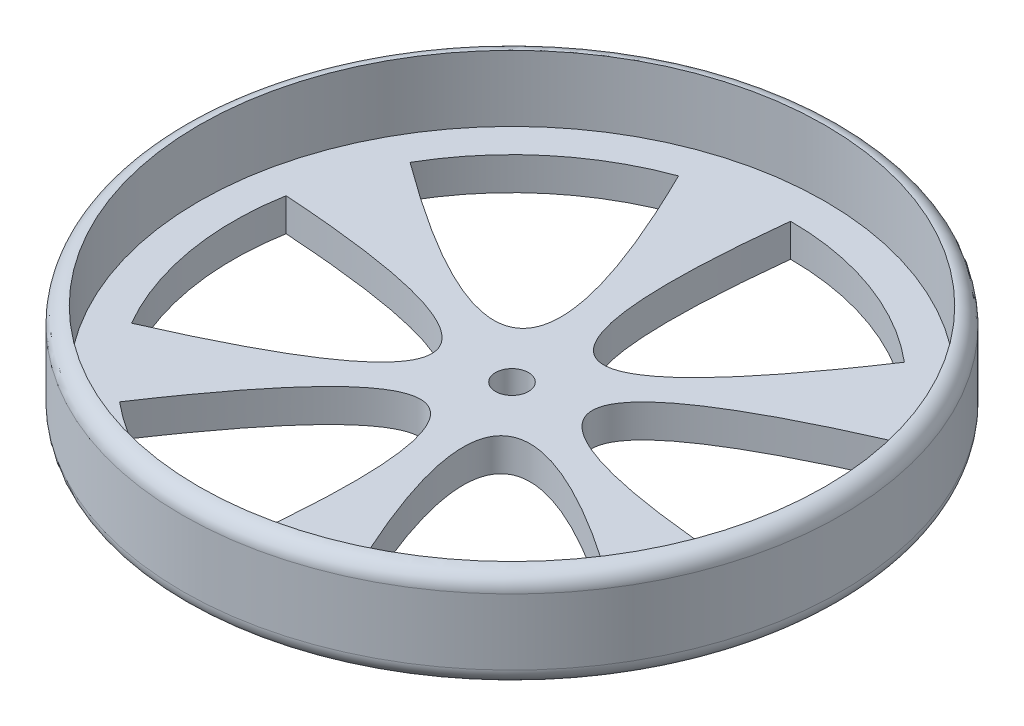
ISO-10303-21;
HEADER;
FILE_DESCRIPTION(('STEP AP214'),'2;1');
FILE_NAME('part.step','',(''),(''),'','','');
FILE_SCHEMA(('AUTOMOTIVE_DESIGN { 1 0 10303 214 1 1 1 1 }'));
ENDSEC;
DATA;
#1=APPLICATION_CONTEXT('core data for automotive mechanical design processes');
#2=APPLICATION_PROTOCOL_DEFINITION('international standard','automotive_design',2000,#1);
#3=PRODUCT_CONTEXT('',#1,'mechanical');
#4=PRODUCT('Part','Part','',(#3));
#5=PRODUCT_RELATED_PRODUCT_CATEGORY('part','',(#4));
#6=PRODUCT_DEFINITION_FORMATION('','',#4);
#7=PRODUCT_DEFINITION_CONTEXT('part definition',#1,'design');
#8=PRODUCT_DEFINITION('design','',#6,#7);
#9=PRODUCT_DEFINITION_SHAPE('','',#8);
#10=(LENGTH_UNIT() NAMED_UNIT(*) SI_UNIT(.MILLI.,.METRE.));
#11=(NAMED_UNIT(*) PLANE_ANGLE_UNIT() SI_UNIT($,.RADIAN.));
#12=(NAMED_UNIT(*) SI_UNIT($,.STERADIAN.) SOLID_ANGLE_UNIT());
#13=UNCERTAINTY_MEASURE_WITH_UNIT(LENGTH_MEASURE(1.E-05),#10,'distance_accuracy_value','');
#14=(GEOMETRIC_REPRESENTATION_CONTEXT(3) GLOBAL_UNCERTAINTY_ASSIGNED_CONTEXT((#13)) GLOBAL_UNIT_ASSIGNED_CONTEXT((#10,
#11,#12)) REPRESENTATION_CONTEXT('',''));
#15=CARTESIAN_POINT('',(0.,0.,0.));
#16=DIRECTION('',(0.,0.,1.));
#17=DIRECTION('',(1.,0.,0.));
#18=AXIS2_PLACEMENT_3D('',#15,#16,#17);
#19=CARTESIAN_POINT('',(0.,47.498,0.));
#20=DIRECTION('',(0.,-1.,0.));
#21=DIRECTION('',(0.,0.,-1.));
#22=AXIS2_PLACEMENT_3D('',#19,#20,#21);
#23=CYLINDRICAL_SURFACE('',#22,21.4669429877492);
#24=DIRECTION('',(0.,-1.,0.));
#25=VECTOR('',#24,1.);
#26=CARTESIAN_POINT('',(-7.34212691743393,47.498,-20.1723279164197));
#27=LINE('',#26,#25);
#28=CARTESIAN_POINT('',(-7.34212691743393,2.54,-20.1723279164197));
#29=VERTEX_POINT('',#28);
#30=CARTESIAN_POINT('',(-7.34212691743393,0.,-20.1723279164197));
#31=VERTEX_POINT('',#30);
#32=EDGE_CURVE('E336',#29,#31,#27,.T.);
#33=ORIENTED_EDGE('',*,*,#32,.F.);
#34=CARTESIAN_POINT('',(0.,2.54,0.));
#35=DIRECTION('',(0.,1.,0.));
#36=DIRECTION('',(0.,0.,1.));
#37=AXIS2_PLACEMENT_3D('',#34,#35,#36);
#38=CIRCLE('',#37,21.4669429877492);
#39=CARTESIAN_POINT('',(-18.590917968983,2.54,-10.7334714938747));
#40=VERTEX_POINT('',#39);
#41=EDGE_CURVE('E138',#29,#40,#38,.T.);
#42=ORIENTED_EDGE('',*,*,#41,.T.);
#43=DIRECTION('',(0.,-1.,0.));
#44=VECTOR('',#43,1.);
#45=CARTESIAN_POINT('',(-18.590917968983,47.498,-10.7334714938747));
#46=LINE('',#45,#44);
#47=CARTESIAN_POINT('',(-18.590917968983,0.,-10.7334714938747));
#48=VERTEX_POINT('',#47);
#49=EDGE_CURVE('E333',#40,#48,#46,.T.);
#50=ORIENTED_EDGE('',*,*,#49,.T.);
#51=CARTESIAN_POINT('',(0.,0.,0.));
#52=DIRECTION('',(0.,1.,0.));
#53=DIRECTION('',(0.,0.,1.));
#54=AXIS2_PLACEMENT_3D('',#51,#52,#53);
#55=CIRCLE('',#54,21.4669429877492);
#56=EDGE_CURVE('E293',#31,#48,#55,.T.);
#57=ORIENTED_EDGE('',*,*,#56,.F.);
#58=EDGE_LOOP('',(#33,#42,#50,#57));
#59=FACE_BOUND('',#58,.T.);
#60=ADVANCED_FACE('F123',(#59),#23,.F.);
#61=CARTESIAN_POINT('',(-18.590917968983,47.498,-10.7334714938747));
#62=CARTESIAN_POINT('',(6.41896161663423,47.498,7.6498205673481));
#63=CARTESIAN_POINT('',(-7.34212691743393,47.498,-20.1723279164197));
#64=B_SPLINE_CURVE_WITH_KNOTS('',2,(#61,#62,#63),.UNSPECIFIED.,.F.,.F.,(3,3),(0.,1.),.UNSPECIFIED.);
#65=DIRECTION('',(0.,-1.,0.));
#66=VECTOR('',#65,1.);
#67=SURFACE_OF_LINEAR_EXTRUSION('',#64,#66);
#68=ORIENTED_EDGE('',*,*,#49,.F.);
#69=CARTESIAN_POINT('',(-18.590917968983,2.54,-10.7334714938747));
#70=CARTESIAN_POINT('',(6.41896161663423,2.54,7.6498205673481));
#71=CARTESIAN_POINT('',(-7.34212691743393,2.54,-20.1723279164197));
#72=B_SPLINE_CURVE_WITH_KNOTS('',2,(#69,#70,#71),.UNSPECIFIED.,.F.,.F.,(3,3),(0.,1.),.UNSPECIFIED.);
#73=EDGE_CURVE('E353',#40,#29,#72,.T.);
#74=ORIENTED_EDGE('',*,*,#73,.T.);
#75=ORIENTED_EDGE('',*,*,#32,.T.);
#76=CARTESIAN_POINT('',(-18.590917968983,0.,-10.7334714938747));
#77=CARTESIAN_POINT('',(6.41896161663423,0.,7.6498205673481));
#78=CARTESIAN_POINT('',(-7.34212691743393,0.,-20.1723279164197));
#79=B_SPLINE_CURVE_WITH_KNOTS('',2,(#76,#77,#78),.UNSPECIFIED.,.F.,.F.,(3,3),(0.,1.),.UNSPECIFIED.);
#80=EDGE_CURVE('E339',#48,#31,#79,.T.);
#81=ORIENTED_EDGE('',*,*,#80,.F.);
#82=EDGE_LOOP('',(#68,#74,#75,#81));
#83=FACE_BOUND('',#82,.T.);
#84=ADVANCED_FACE('F302',(#83),#67,.T.);
#85=CARTESIAN_POINT('',(0.,47.498,0.));
#86=DIRECTION('',(0.,-1.,0.));
#87=DIRECTION('',(0.,0.,-1.));
#88=AXIS2_PLACEMENT_3D('',#85,#86,#87);
#89=CYLINDRICAL_SURFACE('',#88,21.4669429877492);
#90=DIRECTION('',(0.,-1.,0.));
#91=VECTOR('',#90,1.);
#92=CARTESIAN_POINT('',(-21.1408118878064,47.498,-3.72769552990252));
#93=LINE('',#92,#91);
#94=CARTESIAN_POINT('',(-21.1408118878064,2.54,-3.72769552990252));
#95=VERTEX_POINT('',#94);
#96=CARTESIAN_POINT('',(-21.1408118878064,0.,-3.72769552990252));
#97=VERTEX_POINT('',#96);
#98=EDGE_CURVE('E582',#95,#97,#93,.T.);
#99=ORIENTED_EDGE('',*,*,#98,.F.);
#100=CARTESIAN_POINT('',(0.,2.54,0.));
#101=DIRECTION('',(0.,1.,0.));
#102=DIRECTION('',(0.,0.,1.));
#103=AXIS2_PLACEMENT_3D('',#100,#101,#102);
#104=CIRCLE('',#103,21.4669429877492);
#105=CARTESIAN_POINT('',(-18.5909179689831,2.54,10.7334714938744));
#106=VERTEX_POINT('',#105);
#107=EDGE_CURVE('E145',#95,#106,#104,.T.);
#108=ORIENTED_EDGE('',*,*,#107,.T.);
#109=DIRECTION('',(0.,-1.,0.));
#110=VECTOR('',#109,1.);
#111=CARTESIAN_POINT('',(-18.5909179689831,47.498,10.7334714938744));
#112=LINE('',#111,#110);
#113=CARTESIAN_POINT('',(-18.5909179689831,0.,10.7334714938744));
#114=VERTEX_POINT('',#113);
#115=EDGE_CURVE('E396',#106,#114,#112,.T.);
#116=ORIENTED_EDGE('',*,*,#115,.T.);
#117=CARTESIAN_POINT('',(0.,0.,0.));
#118=DIRECTION('',(0.,1.,0.));
#119=DIRECTION('',(0.,0.,1.));
#120=AXIS2_PLACEMENT_3D('',#117,#118,#119);
#121=CIRCLE('',#120,21.4669429877492);
#122=EDGE_CURVE('E368',#97,#114,#121,.T.);
#123=ORIENTED_EDGE('',*,*,#122,.F.);
#124=EDGE_LOOP('',(#99,#108,#116,#123));
#125=FACE_BOUND('',#124,.T.);
#126=ADVANCED_FACE('F305',(#125),#89,.F.);
#127=CARTESIAN_POINT('',(-18.5909179689831,47.498,10.7334714938744));
#128=CARTESIAN_POINT('',(9.8344197540333,47.498,-1.73407354224831));
#129=CARTESIAN_POINT('',(-21.1408118878064,47.498,-3.72769552990252));
#130=B_SPLINE_CURVE_WITH_KNOTS('',2,(#127,#128,#129),.UNSPECIFIED.,.F.,.F.,(3,3),(0.,1.),.UNSPECIFIED.);
#131=DIRECTION('',(0.,-1.,0.));
#132=VECTOR('',#131,1.);
#133=SURFACE_OF_LINEAR_EXTRUSION('',#130,#132);
#134=ORIENTED_EDGE('',*,*,#115,.F.);
#135=CARTESIAN_POINT('',(-18.5909179689831,2.54,10.7334714938744));
#136=CARTESIAN_POINT('',(9.8344197540333,2.54,-1.73407354224831));
#137=CARTESIAN_POINT('',(-21.1408118878064,2.54,-3.72769552990252));
#138=B_SPLINE_CURVE_WITH_KNOTS('',2,(#135,#136,#137),.UNSPECIFIED.,.F.,.F.,(3,3),(0.,1.),.UNSPECIFIED.);
#139=EDGE_CURVE('E357',#106,#95,#138,.T.);
#140=ORIENTED_EDGE('',*,*,#139,.T.);
#141=ORIENTED_EDGE('',*,*,#98,.T.);
#142=CARTESIAN_POINT('',(-18.5909179689831,0.,10.7334714938744));
#143=CARTESIAN_POINT('',(9.8344197540333,0.,-1.73407354224831));
#144=CARTESIAN_POINT('',(-21.1408118878064,0.,-3.72769552990252));
#145=B_SPLINE_CURVE_WITH_KNOTS('',2,(#142,#143,#144),.UNSPECIFIED.,.F.,.F.,(3,3),(0.,1.),.UNSPECIFIED.);
#146=EDGE_CURVE('E586',#114,#97,#145,.T.);
#147=ORIENTED_EDGE('',*,*,#146,.F.);
#148=EDGE_LOOP('',(#134,#140,#141,#147));
#149=FACE_BOUND('',#148,.T.);
#150=ADVANCED_FACE('F259',(#149),#133,.T.);
#151=CARTESIAN_POINT('',(0.,47.498,0.));
#152=DIRECTION('',(0.,-1.,0.));
#153=DIRECTION('',(0.,0.,-1.));
#154=AXIS2_PLACEMENT_3D('',#151,#152,#153);
#155=CYLINDRICAL_SURFACE('',#154,21.4669429877492);
#156=DIRECTION('',(0.,-1.,0.));
#157=VECTOR('',#156,1.);
#158=CARTESIAN_POINT('',(21.1408118878064,47.498,3.72769552990275));
#159=LINE('',#158,#157);
#160=CARTESIAN_POINT('',(21.1408118878064,2.54,3.72769552990275));
#161=VERTEX_POINT('',#160);
#162=CARTESIAN_POINT('',(21.1408118878064,0.,3.72769552990275));
#163=VERTEX_POINT('',#162);
#164=EDGE_CURVE('E556',#161,#163,#159,.T.);
#165=ORIENTED_EDGE('',*,*,#164,.F.);
#166=CARTESIAN_POINT('',(0.,2.54,0.));
#167=DIRECTION('',(0.,1.,0.));
#168=DIRECTION('',(0.,0.,1.));
#169=AXIS2_PLACEMENT_3D('',#166,#167,#168);
#170=CIRCLE('',#169,21.4669429877492);
#171=CARTESIAN_POINT('',(18.5909179689831,2.54,-10.7334714938744));
#172=VERTEX_POINT('',#171);
#173=EDGE_CURVE('E558',#161,#172,#170,.T.);
#174=ORIENTED_EDGE('',*,*,#173,.T.);
#175=DIRECTION('',(0.,-1.,0.));
#176=VECTOR('',#175,1.);
#177=CARTESIAN_POINT('',(18.5909179689831,47.498,-10.7334714938744));
#178=LINE('',#177,#176);
#179=CARTESIAN_POINT('',(18.5909179689831,0.,-10.7334714938744));
#180=VERTEX_POINT('',#179);
#181=EDGE_CURVE('E273',#172,#180,#178,.T.);
#182=ORIENTED_EDGE('',*,*,#181,.T.);
#183=CARTESIAN_POINT('',(0.,0.,0.));
#184=DIRECTION('',(0.,1.,0.));
#185=DIRECTION('',(0.,0.,1.));
#186=AXIS2_PLACEMENT_3D('',#183,#184,#185);
#187=CIRCLE('',#186,21.4669429877492);
#188=EDGE_CURVE('E233',#163,#180,#187,.T.);
#189=ORIENTED_EDGE('',*,*,#188,.F.);
#190=EDGE_LOOP('',(#165,#174,#182,#189));
#191=FACE_BOUND('',#190,.T.);
#192=ADVANCED_FACE('F254',(#191),#155,.F.);
#193=CARTESIAN_POINT('',(18.5909179689831,47.498,-10.7334714938744));
#194=CARTESIAN_POINT('',(-9.83441975403328,47.498,1.73407354224822));
#195=CARTESIAN_POINT('',(21.1408118878064,47.498,3.72769552990275));
#196=B_SPLINE_CURVE_WITH_KNOTS('',2,(#193,#194,#195),.UNSPECIFIED.,.F.,.F.,(3,3),(0.,1.),.UNSPECIFIED.);
#197=DIRECTION('',(0.,-1.,0.));
#198=VECTOR('',#197,1.);
#199=SURFACE_OF_LINEAR_EXTRUSION('',#196,#198);
#200=ORIENTED_EDGE('',*,*,#181,.F.);
#201=CARTESIAN_POINT('',(18.5909179689831,2.54,-10.7334714938744));
#202=CARTESIAN_POINT('',(-9.83441975403328,2.54,1.73407354224822));
#203=CARTESIAN_POINT('',(21.1408118878064,2.54,3.72769552990275));
#204=B_SPLINE_CURVE_WITH_KNOTS('',2,(#201,#202,#203),.UNSPECIFIED.,.F.,.F.,(3,3),(0.,1.),.UNSPECIFIED.);
#205=EDGE_CURVE('E535',#172,#161,#204,.T.);
#206=ORIENTED_EDGE('',*,*,#205,.T.);
#207=ORIENTED_EDGE('',*,*,#164,.T.);
#208=CARTESIAN_POINT('',(18.5909179689831,0.,-10.7334714938744));
#209=CARTESIAN_POINT('',(-9.83441975403328,0.,1.73407354224822));
#210=CARTESIAN_POINT('',(21.1408118878064,0.,3.72769552990275));
#211=B_SPLINE_CURVE_WITH_KNOTS('',2,(#208,#209,#210),.UNSPECIFIED.,.F.,.F.,(3,3),(0.,1.),.UNSPECIFIED.);
#212=EDGE_CURVE('E236',#180,#163,#211,.T.);
#213=ORIENTED_EDGE('',*,*,#212,.F.);
#214=EDGE_LOOP('',(#200,#206,#207,#213));
#215=FACE_BOUND('',#214,.T.);
#216=ADVANCED_FACE('F249',(#215),#199,.T.);
#217=CARTESIAN_POINT('',(0.,47.498,0.));
#218=DIRECTION('',(0.,-1.,0.));
#219=DIRECTION('',(0.,0.,-1.));
#220=AXIS2_PLACEMENT_3D('',#217,#218,#219);
#221=CYLINDRICAL_SURFACE('',#220,21.4669429877492);
#222=DIRECTION('',(0.,-1.,0.));
#223=VECTOR('',#222,1.);
#224=CARTESIAN_POINT('',(13.7986849703725,47.498,-16.4446323865171));
#225=LINE('',#224,#223);
#226=CARTESIAN_POINT('',(13.7986849703725,2.54,-16.4446323865171));
#227=VERTEX_POINT('',#226);
#228=CARTESIAN_POINT('',(13.7986849703725,0.,-16.4446323865171));
#229=VERTEX_POINT('',#228);
#230=EDGE_CURVE('E286',#227,#229,#225,.T.);
#231=ORIENTED_EDGE('',*,*,#230,.F.);
#232=CARTESIAN_POINT('',(0.,2.54,0.));
#233=DIRECTION('',(0.,1.,0.));
#234=DIRECTION('',(0.,0.,1.));
#235=AXIS2_PLACEMENT_3D('',#232,#233,#234);
#236=CIRCLE('',#235,21.4669429877492);
#237=CARTESIAN_POINT('',(0.,2.54,-21.4669429877492));
#238=VERTEX_POINT('',#237);
#239=EDGE_CURVE('E564',#227,#238,#236,.T.);
#240=ORIENTED_EDGE('',*,*,#239,.T.);
#241=DIRECTION('',(0.,-1.,0.));
#242=VECTOR('',#241,1.);
#243=CARTESIAN_POINT('',(0.,47.498,-21.4669429877492));
#244=LINE('',#243,#242);
#245=CARTESIAN_POINT('',(0.,0.,-21.4669429877492));
#246=VERTEX_POINT('',#245);
#247=EDGE_CURVE('E291',#238,#246,#244,.T.);
#248=ORIENTED_EDGE('',*,*,#247,.T.);
#249=CARTESIAN_POINT('',(0.,0.,0.));
#250=DIRECTION('',(0.,1.,0.));
#251=DIRECTION('',(0.,0.,1.));
#252=AXIS2_PLACEMENT_3D('',#249,#250,#251);
#253=CIRCLE('',#252,21.4669429877492);
#254=EDGE_CURVE('E275',#229,#246,#253,.T.);
#255=ORIENTED_EDGE('',*,*,#254,.F.);
#256=EDGE_LOOP('',(#231,#240,#248,#255));
#257=FACE_BOUND('',#256,.T.);
#258=ADVANCED_FACE('F253',(#257),#221,.F.);
#259=CARTESIAN_POINT('',(0.,47.498,-21.4669429877492));
#260=CARTESIAN_POINT('',(-3.41545813739902,47.498,9.3838941095965));
#261=CARTESIAN_POINT('',(13.7986849703725,47.498,-16.4446323865171));
#262=B_SPLINE_CURVE_WITH_KNOTS('',2,(#259,#260,#261),.UNSPECIFIED.,.F.,.F.,(3,3),(0.,1.),.UNSPECIFIED.);
#263=DIRECTION('',(0.,-1.,0.));
#264=VECTOR('',#263,1.);
#265=SURFACE_OF_LINEAR_EXTRUSION('',#262,#264);
#266=ORIENTED_EDGE('',*,*,#247,.F.);
#267=CARTESIAN_POINT('',(0.,2.54,-21.4669429877492));
#268=CARTESIAN_POINT('',(-3.41545813739902,2.54,9.3838941095965));
#269=CARTESIAN_POINT('',(13.7986849703725,2.54,-16.4446323865171));
#270=B_SPLINE_CURVE_WITH_KNOTS('',2,(#267,#268,#269),.UNSPECIFIED.,.F.,.F.,(3,3),(0.,1.),.UNSPECIFIED.);
#271=EDGE_CURVE('E539',#238,#227,#270,.T.);
#272=ORIENTED_EDGE('',*,*,#271,.T.);
#273=ORIENTED_EDGE('',*,*,#230,.T.);
#274=CARTESIAN_POINT('',(0.,0.,-21.4669429877492));
#275=CARTESIAN_POINT('',(-3.41545813739902,0.,9.3838941095965));
#276=CARTESIAN_POINT('',(13.7986849703725,0.,-16.4446323865171));
#277=B_SPLINE_CURVE_WITH_KNOTS('',2,(#274,#275,#276),.UNSPECIFIED.,.F.,.F.,(3,3),(0.,1.),.UNSPECIFIED.);
#278=EDGE_CURVE('E281',#246,#229,#277,.T.);
#279=ORIENTED_EDGE('',*,*,#278,.F.);
#280=EDGE_LOOP('',(#266,#272,#273,#279));
#281=FACE_BOUND('',#280,.T.);
#282=ADVANCED_FACE('F261',(#281),#265,.T.);
#283=CARTESIAN_POINT('',(0.,47.498,0.));
#284=DIRECTION('',(0.,-1.,0.));
#285=DIRECTION('',(0.,0.,-1.));
#286=AXIS2_PLACEMENT_3D('',#283,#284,#285);
#287=CYLINDRICAL_SURFACE('',#286,21.4669429877492);
#288=DIRECTION('',(0.,-1.,0.));
#289=VECTOR('',#288,1.);
#290=CARTESIAN_POINT('',(-13.7986849703725,47.498,16.4446323865172));
#291=LINE('',#290,#289);
#292=CARTESIAN_POINT('',(-13.7986849703725,2.54,16.4446323865172));
#293=VERTEX_POINT('',#292);
#294=CARTESIAN_POINT('',(-13.7986849703725,0.,16.4446323865172));
#295=VERTEX_POINT('',#294);
#296=EDGE_CURVE('E409',#293,#295,#291,.T.);
#297=ORIENTED_EDGE('',*,*,#296,.F.);
#298=CARTESIAN_POINT('',(0.,2.54,0.));
#299=DIRECTION('',(0.,1.,0.));
#300=DIRECTION('',(0.,0.,1.));
#301=AXIS2_PLACEMENT_3D('',#298,#299,#300);
#302=CIRCLE('',#301,21.4669429877492);
#303=CARTESIAN_POINT('',(0.,2.54,21.4669429877492));
#304=VERTEX_POINT('',#303);
#305=EDGE_CURVE('E543',#293,#304,#302,.T.);
#306=ORIENTED_EDGE('',*,*,#305,.T.);
#307=DIRECTION('',(0.,-1.,0.));
#308=VECTOR('',#307,1.);
#309=CARTESIAN_POINT('',(0.,47.498,21.4669429877492));
#310=LINE('',#309,#308);
#311=CARTESIAN_POINT('',(0.,0.,21.4669429877492));
#312=VERTEX_POINT('',#311);
#313=EDGE_CURVE('E414',#304,#312,#310,.T.);
#314=ORIENTED_EDGE('',*,*,#313,.T.);
#315=CARTESIAN_POINT('',(0.,0.,0.));
#316=DIRECTION('',(0.,1.,0.));
#317=DIRECTION('',(0.,0.,1.));
#318=AXIS2_PLACEMENT_3D('',#315,#316,#317);
#319=CIRCLE('',#318,21.4669429877492);
#320=EDGE_CURVE('E398',#295,#312,#319,.T.);
#321=ORIENTED_EDGE('',*,*,#320,.F.);
#322=EDGE_LOOP('',(#297,#306,#314,#321));
#323=FACE_BOUND('',#322,.T.);
#324=ADVANCED_FACE('F265',(#323),#287,.F.);
#325=CARTESIAN_POINT('',(0.,47.498,21.4669429877492));
#326=CARTESIAN_POINT('',(3.41545813739902,47.498,-9.38389410959651));
#327=CARTESIAN_POINT('',(-13.7986849703725,47.498,16.4446323865172));
#328=B_SPLINE_CURVE_WITH_KNOTS('',2,(#325,#326,#327),.UNSPECIFIED.,.F.,.F.,(3,3),(0.,1.),.UNSPECIFIED.);
#329=DIRECTION('',(0.,-1.,0.));
#330=VECTOR('',#329,1.);
#331=SURFACE_OF_LINEAR_EXTRUSION('',#328,#330);
#332=ORIENTED_EDGE('',*,*,#313,.F.);
#333=CARTESIAN_POINT('',(0.,2.54,21.4669429877492));
#334=CARTESIAN_POINT('',(3.41545813739902,2.54,-9.38389410959651));
#335=CARTESIAN_POINT('',(-13.7986849703725,2.54,16.4446323865172));
#336=B_SPLINE_CURVE_WITH_KNOTS('',2,(#333,#334,#335),.UNSPECIFIED.,.F.,.F.,(3,3),(0.,1.),.UNSPECIFIED.);
#337=EDGE_CURVE('E227',#304,#293,#336,.T.);
#338=ORIENTED_EDGE('',*,*,#337,.T.);
#339=ORIENTED_EDGE('',*,*,#296,.T.);
#340=CARTESIAN_POINT('',(0.,0.,21.4669429877492));
#341=CARTESIAN_POINT('',(3.41545813739902,0.,-9.38389410959651));
#342=CARTESIAN_POINT('',(-13.7986849703725,0.,16.4446323865172));
#343=B_SPLINE_CURVE_WITH_KNOTS('',2,(#340,#341,#342),.UNSPECIFIED.,.F.,.F.,(3,3),(0.,1.),.UNSPECIFIED.);
#344=EDGE_CURVE('E404',#312,#295,#343,.T.);
#345=ORIENTED_EDGE('',*,*,#344,.F.);
#346=EDGE_LOOP('',(#332,#338,#339,#345));
#347=FACE_BOUND('',#346,.T.);
#348=ADVANCED_FACE('F386',(#347),#331,.T.);
#349=CARTESIAN_POINT('',(0.,47.498,0.));
#350=DIRECTION('',(0.,-1.,0.));
#351=DIRECTION('',(0.,0.,-1.));
#352=AXIS2_PLACEMENT_3D('',#349,#350,#351);
#353=CYLINDRICAL_SURFACE('',#352,21.4669429877492);
#354=DIRECTION('',(0.,-1.,0.));
#355=VECTOR('',#354,1.);
#356=CARTESIAN_POINT('',(7.34212691743394,47.498,20.1723279164197));
#357=LINE('',#356,#355);
#358=CARTESIAN_POINT('',(7.34212691743394,2.54,20.1723279164197));
#359=VERTEX_POINT('',#358);
#360=CARTESIAN_POINT('',(7.34212691743394,0.,20.1723279164197));
#361=VERTEX_POINT('',#360);
#362=EDGE_CURVE('E226',#359,#361,#357,.T.);
#363=ORIENTED_EDGE('',*,*,#362,.F.);
#364=CARTESIAN_POINT('',(0.,2.54,0.));
#365=DIRECTION('',(0.,1.,0.));
#366=DIRECTION('',(0.,0.,1.));
#367=AXIS2_PLACEMENT_3D('',#364,#365,#366);
#368=CIRCLE('',#367,21.4669429877492);
#369=CARTESIAN_POINT('',(18.590917968983,2.54,10.7334714938747));
#370=VERTEX_POINT('',#369);
#371=EDGE_CURVE('E216',#359,#370,#368,.T.);
#372=ORIENTED_EDGE('',*,*,#371,.T.);
#373=DIRECTION('',(0.,-1.,0.));
#374=VECTOR('',#373,1.);
#375=CARTESIAN_POINT('',(18.590917968983,47.498,10.7334714938747));
#376=LINE('',#375,#374);
#377=CARTESIAN_POINT('',(18.590917968983,0.,10.7334714938747));
#378=VERTEX_POINT('',#377);
#379=EDGE_CURVE('E224',#370,#378,#376,.T.);
#380=ORIENTED_EDGE('',*,*,#379,.T.);
#381=CARTESIAN_POINT('',(0.,0.,0.));
#382=DIRECTION('',(0.,1.,0.));
#383=DIRECTION('',(0.,0.,1.));
#384=AXIS2_PLACEMENT_3D('',#381,#382,#383);
#385=CIRCLE('',#384,21.4669429877492);
#386=EDGE_CURVE('E416',#361,#378,#385,.T.);
#387=ORIENTED_EDGE('',*,*,#386,.F.);
#388=EDGE_LOOP('',(#363,#372,#380,#387));
#389=FACE_BOUND('',#388,.T.);
#390=ADVANCED_FACE('F222',(#389),#353,.F.);
#391=CARTESIAN_POINT('',(18.590917968983,47.498,10.7334714938747));
#392=CARTESIAN_POINT('',(-6.41896161663425,47.498,-7.64982056734809));
#393=CARTESIAN_POINT('',(7.34212691743394,47.498,20.1723279164197));
#394=B_SPLINE_CURVE_WITH_KNOTS('',2,(#391,#392,#393),.UNSPECIFIED.,.F.,.F.,(3,3),(0.,1.),.UNSPECIFIED.);
#395=DIRECTION('',(0.,-1.,0.));
#396=VECTOR('',#395,1.);
#397=SURFACE_OF_LINEAR_EXTRUSION('',#394,#396);
#398=ORIENTED_EDGE('',*,*,#379,.F.);
#399=CARTESIAN_POINT('',(18.590917968983,2.54,10.7334714938747));
#400=CARTESIAN_POINT('',(-6.41896161663425,2.54,-7.64982056734809));
#401=CARTESIAN_POINT('',(7.34212691743394,2.54,20.1723279164197));
#402=B_SPLINE_CURVE_WITH_KNOTS('',2,(#399,#400,#401),.UNSPECIFIED.,.F.,.F.,(3,3),(0.,1.),.UNSPECIFIED.);
#403=EDGE_CURVE('E212',#370,#359,#402,.T.);
#404=ORIENTED_EDGE('',*,*,#403,.T.);
#405=ORIENTED_EDGE('',*,*,#362,.T.);
#406=CARTESIAN_POINT('',(18.590917968983,0.,10.7334714938747));
#407=CARTESIAN_POINT('',(-6.41896161663425,0.,-7.64982056734809));
#408=CARTESIAN_POINT('',(7.34212691743394,0.,20.1723279164197));
#409=B_SPLINE_CURVE_WITH_KNOTS('',2,(#406,#407,#408),.UNSPECIFIED.,.F.,.F.,(3,3),(0.,1.),.UNSPECIFIED.);
#410=EDGE_CURVE('E231',#378,#361,#409,.T.);
#411=ORIENTED_EDGE('',*,*,#410,.F.);
#412=EDGE_LOOP('',(#398,#404,#405,#411));
#413=FACE_BOUND('',#412,.T.);
#414=ADVANCED_FACE('F229',(#413),#397,.T.);
#415=CARTESIAN_POINT('',(0.,61.214,0.));
#416=DIRECTION('',(0.,-1.,0.));
#417=DIRECTION('',(0.,0.,-1.));
#418=AXIS2_PLACEMENT_3D('',#415,#416,#417);
#419=CYLINDRICAL_SURFACE('',#418,1.27);
#420=CARTESIAN_POINT('',(0.,0.,0.));
#421=DIRECTION('',(0.,1.,0.));
#422=DIRECTION('',(0.,0.,1.));
#423=AXIS2_PLACEMENT_3D('',#420,#421,#422);
#424=CIRCLE('',#423,1.27);
#425=CARTESIAN_POINT('',(0.,0.,-1.27));
#426=VERTEX_POINT('',#425);
#427=EDGE_CURVE('E355',#426,#426,#424,.T.);
#428=CARTESIAN_POINT('',(0.,2.54,0.));
#429=DIRECTION('',(0.,1.,0.));
#430=DIRECTION('',(0.,0.,1.));
#431=AXIS2_PLACEMENT_3D('',#428,#429,#430);
#432=CIRCLE('',#431,1.27);
#433=CARTESIAN_POINT('',(0.,2.53999999999999,-1.27));
#434=VERTEX_POINT('',#433);
#435=EDGE_CURVE('E127',#434,#434,#432,.T.);
#436=CARTESIAN_POINT('',(0.,0.,-1.27));
#437=CARTESIAN_POINT('',(0.,0.0264583333333262,-1.27));
#438=CARTESIAN_POINT('',(0.,0.0529166666666594,-1.27));
#439=CARTESIAN_POINT('',(0.,0.105833333333326,-1.27));
#440=CARTESIAN_POINT('',(0.,0.132291666666659,-1.27));
#441=CARTESIAN_POINT('',(0.,0.185208333333325,-1.27));
#442=CARTESIAN_POINT('',(0.,0.211666666666659,-1.27));
#443=CARTESIAN_POINT('',(0.,0.264583333333325,-1.27));
#444=CARTESIAN_POINT('',(0.,0.291041666666658,-1.27));
#445=CARTESIAN_POINT('',(0.,0.343958333333325,-1.27));
#446=CARTESIAN_POINT('',(0.,0.370416666666658,-1.27));
#447=CARTESIAN_POINT('',(0.,0.423333333333324,-1.27));
#448=CARTESIAN_POINT('',(0.,0.449791666666657,-1.27));
#449=CARTESIAN_POINT('',(0.,0.502708333333324,-1.27));
#450=CARTESIAN_POINT('',(0.,0.529166666666657,-1.27));
#451=CARTESIAN_POINT('',(0.,0.582083333333323,-1.27));
#452=CARTESIAN_POINT('',(0.,0.608541666666657,-1.27));
#453=CARTESIAN_POINT('',(0.,0.661458333333325,-1.27));
#454=CARTESIAN_POINT('',(0.,0.687916666666661,-1.27));
#455=CARTESIAN_POINT('',(0.,0.740833333333329,-1.27));
#456=CARTESIAN_POINT('',(0.,0.767291666666663,-1.27));
#457=CARTESIAN_POINT('',(0.,0.820208333333329,-1.27));
#458=CARTESIAN_POINT('',(0.,0.846666666666662,-1.27));
#459=CARTESIAN_POINT('',(0.,0.899583333333329,-1.27));
#460=CARTESIAN_POINT('',(0.,0.926041666666662,-1.27));
#461=CARTESIAN_POINT('',(0.,0.978958333333328,-1.27));
#462=CARTESIAN_POINT('',(0.,1.00541666666666,-1.27));
#463=CARTESIAN_POINT('',(0.,1.05833333333333,-1.27));
#464=CARTESIAN_POINT('',(0.,1.08479166666666,-1.27));
#465=CARTESIAN_POINT('',(0.,1.13770833333333,-1.27));
#466=CARTESIAN_POINT('',(0.,1.16416666666666,-1.27));
#467=CARTESIAN_POINT('',(0.,1.21708333333333,-1.27));
#468=CARTESIAN_POINT('',(0.,1.24354166666666,-1.27));
#469=CARTESIAN_POINT('',(0.,1.29645833333333,-1.27));
#470=CARTESIAN_POINT('',(0.,1.32291666666666,-1.27));
#471=CARTESIAN_POINT('',(0.,1.37583333333333,-1.27));
#472=CARTESIAN_POINT('',(0.,1.40229166666666,-1.27));
#473=CARTESIAN_POINT('',(0.,1.45520833333333,-1.27));
#474=CARTESIAN_POINT('',(0.,1.48166666666666,-1.27));
#475=CARTESIAN_POINT('',(0.,1.53458333333333,-1.27));
#476=CARTESIAN_POINT('',(0.,1.56104166666666,-1.27));
#477=CARTESIAN_POINT('',(0.,1.61395833333332,-1.27));
#478=CARTESIAN_POINT('',(0.,1.64041666666666,-1.27));
#479=CARTESIAN_POINT('',(0.,1.69333333333332,-1.27));
#480=CARTESIAN_POINT('',(0.,1.71979166666666,-1.27));
#481=CARTESIAN_POINT('',(0.,1.77270833333332,-1.27));
#482=CARTESIAN_POINT('',(0.,1.79916666666666,-1.27));
#483=CARTESIAN_POINT('',(0.,1.85208333333333,-1.27));
#484=CARTESIAN_POINT('',(0.,1.87854166666666,-1.27));
#485=CARTESIAN_POINT('',(0.,1.93145833333333,-1.27));
#486=CARTESIAN_POINT('',(0.,1.95791666666666,-1.27));
#487=CARTESIAN_POINT('',(0.,2.01083333333333,-1.27));
#488=CARTESIAN_POINT('',(0.,2.03729166666666,-1.27));
#489=CARTESIAN_POINT('',(0.,2.09020833333333,-1.27));
#490=CARTESIAN_POINT('',(0.,2.11666666666666,-1.27));
#491=CARTESIAN_POINT('',(0.,2.16958333333333,-1.27));
#492=CARTESIAN_POINT('',(0.,2.19604166666666,-1.27));
#493=CARTESIAN_POINT('',(0.,2.24895833333333,-1.27));
#494=CARTESIAN_POINT('',(0.,2.27541666666666,-1.27));
#495=CARTESIAN_POINT('',(0.,2.32833333333333,-1.27));
#496=CARTESIAN_POINT('',(0.,2.35479166666666,-1.27));
#497=CARTESIAN_POINT('',(0.,2.40770833333333,-1.27));
#498=CARTESIAN_POINT('',(0.,2.43416666666666,-1.27));
#499=CARTESIAN_POINT('',(0.,2.48708333333333,-1.27));
#500=CARTESIAN_POINT('',(0.,2.51354166666666,-1.27));
#501=CARTESIAN_POINT('',(0.,2.53999999999999,-1.27));
#502=B_SPLINE_CURVE_WITH_KNOTS('',3,(#436,#437,#438,#439,#440,#441,#442,#443,#444,#445,#446,
#447,#448,#449,#450,#451,#452,#453,#454,#455,#456,#457,#458,#459,#460,#461,#462,#463,#464,#465,
#466,#467,#468,#469,#470,#471,#472,#473,#474,#475,#476,#477,#478,#479,#480,#481,#482,#483,#484,
#485,#486,#487,#488,#489,#490,#491,#492,#493,#494,#495,#496,#497,#498,#499,#500,#501),
.UNSPECIFIED.,.F.,.F.,(4,2,2,2,2,2,2,2,2,2,2,2,2,2,2,2,2,2,2,2,2,2,2,2,2,2,2,2,2,2,2,2,4),(0.,
0.0793749999999996,0.158749999999999,0.238124999999999,0.317499999999998,0.396874999999998,
0.476249999999998,0.555624999999997,0.634999999999997,0.714375000000003,0.793750000000003,
0.873125000000002,0.952500000000002,1.031875,1.11125,1.190625,1.27,1.349375,1.42875,1.508125,
1.5875,1.666875,1.74625,1.825625,1.905,1.984375,2.06375,2.143125,2.2225,2.301875,2.38125,
2.460625,2.54),.UNSPECIFIED.);
#503=EDGE_CURVE('BSEAM314',#426,#434,#502,.T.);
#504=ORIENTED_EDGE('',*,*,#427,.F.);
#505=ORIENTED_EDGE('',*,*,#435,.T.);
#506=ORIENTED_EDGE('',*,*,#503,.T.);
#507=ORIENTED_EDGE('',*,*,#503,.F.);
#508=EDGE_LOOP('',(#504,#506,#505,#507));
#509=FACE_BOUND('',#508,.T.);
#510=ADVANCED_FACE('F314',(#509),#419,.F.);
#511=CARTESIAN_POINT('',(0.,0.,0.));
#512=DIRECTION('',(0.,1.,0.));
#513=DIRECTION('',(0.,0.,1.));
#514=AXIS2_PLACEMENT_3D('',#511,#512,#513);
#515=PLANE('',#514);
#516=CARTESIAN_POINT('',(0.,0.,0.));
#517=DIRECTION('',(0.,1.,0.));
#518=DIRECTION('',(0.,0.,1.));
#519=AXIS2_PLACEMENT_3D('',#516,#517,#518);
#520=CIRCLE('',#519,24.13);
#521=CARTESIAN_POINT('',(0.,0.,24.13));
#522=VERTEX_POINT('',#521);
#523=EDGE_CURVE('E132',#522,#522,#520,.F.);
#524=ORIENTED_EDGE('',*,*,#523,.T.);
#525=EDGE_LOOP('',(#524));
#526=FACE_BOUND('',#525,.T.);
#527=ORIENTED_EDGE('',*,*,#427,.T.);
#528=EDGE_LOOP('',(#527));
#529=FACE_BOUND('',#528,.T.);
#530=ORIENTED_EDGE('',*,*,#320,.T.);
#531=ORIENTED_EDGE('',*,*,#344,.T.);
#532=EDGE_LOOP('',(#530,#531));
#533=FACE_BOUND('',#532,.T.);
#534=ORIENTED_EDGE('',*,*,#188,.T.);
#535=ORIENTED_EDGE('',*,*,#212,.T.);
#536=EDGE_LOOP('',(#534,#535));
#537=FACE_BOUND('',#536,.T.);
#538=ORIENTED_EDGE('',*,*,#56,.T.);
#539=ORIENTED_EDGE('',*,*,#80,.T.);
#540=EDGE_LOOP('',(#538,#539));
#541=FACE_BOUND('',#540,.T.);
#542=ORIENTED_EDGE('',*,*,#122,.T.);
#543=ORIENTED_EDGE('',*,*,#146,.T.);
#544=EDGE_LOOP('',(#542,#543));
#545=FACE_BOUND('',#544,.T.);
#546=ORIENTED_EDGE('',*,*,#254,.T.);
#547=ORIENTED_EDGE('',*,*,#278,.T.);
#548=EDGE_LOOP('',(#546,#547));
#549=FACE_BOUND('',#548,.T.);
#550=ORIENTED_EDGE('',*,*,#386,.T.);
#551=ORIENTED_EDGE('',*,*,#410,.T.);
#552=EDGE_LOOP('',(#550,#551));
#553=FACE_BOUND('',#552,.T.);
#554=ADVANCED_FACE('F310',(#526,#529,#533,#537,#541,#545,#549,#553),#515,.F.);
#555=CARTESIAN_POINT('',(0.,7.62,0.));
#556=DIRECTION('',(0.,-1.,0.));
#557=DIRECTION('',(0.,0.,-1.));
#558=AXIS2_PLACEMENT_3D('',#555,#556,#557);
#559=CYLINDRICAL_SURFACE('',#558,25.4);
#560=CARTESIAN_POINT('',(0.,6.35,0.));
#561=DIRECTION('',(0.,1.,0.));
#562=DIRECTION('',(0.,0.,1.));
#563=AXIS2_PLACEMENT_3D('',#560,#561,#562);
#564=CIRCLE('',#563,25.4);
#565=CARTESIAN_POINT('',(0.,6.35,-25.4));
#566=VERTEX_POINT('',#565);
#567=EDGE_CURVE('E12',#566,#566,#564,.F.);
#568=CARTESIAN_POINT('',(0.,1.27,0.));
#569=DIRECTION('',(0.,1.,0.));
#570=DIRECTION('',(0.,0.,1.));
#571=AXIS2_PLACEMENT_3D('',#568,#569,#570);
#572=CIRCLE('',#571,25.4);
#573=CARTESIAN_POINT('',(0.,1.27,-25.4));
#574=VERTEX_POINT('',#573);
#575=EDGE_CURVE('E331',#574,#574,#572,.T.);
#576=CARTESIAN_POINT('',(0.,6.35,-25.4));
#577=CARTESIAN_POINT('',(0.,6.29708333333333,-25.4));
#578=CARTESIAN_POINT('',(0.,6.24416666666666,-25.4));
#579=CARTESIAN_POINT('',(0.,6.13833333333333,-25.4));
#580=CARTESIAN_POINT('',(0.,6.08541666666667,-25.4));
#581=CARTESIAN_POINT('',(0.,5.97958333333333,-25.4));
#582=CARTESIAN_POINT('',(0.,5.92666666666666,-25.4));
#583=CARTESIAN_POINT('',(0.,5.82083333333333,-25.4));
#584=CARTESIAN_POINT('',(0.,5.76791666666667,-25.4));
#585=CARTESIAN_POINT('',(0.,5.66208333333333,-25.4));
#586=CARTESIAN_POINT('',(0.,5.60916666666667,-25.4));
#587=CARTESIAN_POINT('',(0.,5.50333333333333,-25.4));
#588=CARTESIAN_POINT('',(0.,5.45041666666667,-25.4));
#589=CARTESIAN_POINT('',(0.,5.34458333333333,-25.4));
#590=CARTESIAN_POINT('',(0.,5.29166666666667,-25.4));
#591=CARTESIAN_POINT('',(0.,5.18583333333333,-25.4));
#592=CARTESIAN_POINT('',(0.,5.13291666666667,-25.4));
#593=CARTESIAN_POINT('',(0.,5.02708333333333,-25.4));
#594=CARTESIAN_POINT('',(0.,4.97416666666667,-25.4));
#595=CARTESIAN_POINT('',(0.,4.86833333333333,-25.4));
#596=CARTESIAN_POINT('',(0.,4.81541666666667,-25.4));
#597=CARTESIAN_POINT('',(0.,4.70958333333333,-25.4));
#598=CARTESIAN_POINT('',(0.,4.65666666666667,-25.4));
#599=CARTESIAN_POINT('',(0.,4.55083333333333,-25.4));
#600=CARTESIAN_POINT('',(0.,4.49791666666667,-25.4));
#601=CARTESIAN_POINT('',(0.,4.39208333333333,-25.4));
#602=CARTESIAN_POINT('',(0.,4.33916666666667,-25.4));
#603=CARTESIAN_POINT('',(0.,4.23333333333333,-25.4));
#604=CARTESIAN_POINT('',(0.,4.18041666666667,-25.4));
#605=CARTESIAN_POINT('',(0.,4.07458333333333,-25.4));
#606=CARTESIAN_POINT('',(0.,4.02166666666667,-25.4));
#607=CARTESIAN_POINT('',(0.,3.91583333333333,-25.4));
#608=CARTESIAN_POINT('',(0.,3.86291666666667,-25.4));
#609=CARTESIAN_POINT('',(0.,3.75708333333333,-25.4));
#610=CARTESIAN_POINT('',(0.,3.70416666666667,-25.4));
#611=CARTESIAN_POINT('',(0.,3.59833333333333,-25.4));
#612=CARTESIAN_POINT('',(0.,3.54541666666667,-25.4));
#613=CARTESIAN_POINT('',(0.,3.43958333333333,-25.4));
#614=CARTESIAN_POINT('',(0.,3.38666666666667,-25.4));
#615=CARTESIAN_POINT('',(0.,3.28083333333333,-25.4));
#616=CARTESIAN_POINT('',(0.,3.22791666666667,-25.4));
#617=CARTESIAN_POINT('',(0.,3.12208333333333,-25.4));
#618=CARTESIAN_POINT('',(0.,3.06916666666667,-25.4));
#619=CARTESIAN_POINT('',(0.,2.96333333333333,-25.4));
#620=CARTESIAN_POINT('',(0.,2.91041666666667,-25.4));
#621=CARTESIAN_POINT('',(0.,2.80458333333333,-25.4));
#622=CARTESIAN_POINT('',(0.,2.75166666666667,-25.4));
#623=CARTESIAN_POINT('',(0.,2.64583333333333,-25.4));
#624=CARTESIAN_POINT('',(0.,2.59291666666667,-25.4));
#625=CARTESIAN_POINT('',(0.,2.48708333333333,-25.4));
#626=CARTESIAN_POINT('',(0.,2.43416666666667,-25.4));
#627=CARTESIAN_POINT('',(0.,2.32833333333333,-25.4));
#628=CARTESIAN_POINT('',(0.,2.27541666666667,-25.4));
#629=CARTESIAN_POINT('',(0.,2.16958333333333,-25.4));
#630=CARTESIAN_POINT('',(0.,2.11666666666667,-25.4));
#631=CARTESIAN_POINT('',(0.,2.01083333333333,-25.4));
#632=CARTESIAN_POINT('',(0.,1.95791666666667,-25.4));
#633=CARTESIAN_POINT('',(0.,1.85208333333333,-25.4));
#634=CARTESIAN_POINT('',(0.,1.79916666666667,-25.4));
#635=CARTESIAN_POINT('',(0.,1.69333333333333,-25.4));
#636=CARTESIAN_POINT('',(0.,1.64041666666667,-25.4));
#637=CARTESIAN_POINT('',(0.,1.53458333333333,-25.4));
#638=CARTESIAN_POINT('',(0.,1.48166666666667,-25.4));
#639=CARTESIAN_POINT('',(0.,1.37583333333333,-25.4));
#640=CARTESIAN_POINT('',(0.,1.32291666666667,-25.4));
#641=CARTESIAN_POINT('',(0.,1.27,-25.4));
#642=B_SPLINE_CURVE_WITH_KNOTS('',3,(#576,#577,#578,#579,#580,#581,#582,#583,#584,#585,#586,
#587,#588,#589,#590,#591,#592,#593,#594,#595,#596,#597,#598,#599,#600,#601,#602,#603,#604,#605,
#606,#607,#608,#609,#610,#611,#612,#613,#614,#615,#616,#617,#618,#619,#620,#621,#622,#623,#624,
#625,#626,#627,#628,#629,#630,#631,#632,#633,#634,#635,#636,#637,#638,#639,#640,#641),
.UNSPECIFIED.,.F.,.F.,(4,2,2,2,2,2,2,2,2,2,2,2,2,2,2,2,2,2,2,2,2,2,2,2,2,2,2,2,2,2,2,2,4),(0.,
0.15875,0.3175,0.47625,0.635,0.79375,0.952499999999999,1.11125,1.27,1.42875,1.5875,1.74625,
1.905,2.06375,2.2225,2.38125,2.54,2.69875,2.8575,3.01625,3.175,3.33375,3.4925,3.65125,3.81,
3.96875,4.1275,4.28625,4.445,4.60375,4.7625,4.92125,5.08),.UNSPECIFIED.);
#643=EDGE_CURVE('BSEAM313',#566,#574,#642,.T.);
#644=ORIENTED_EDGE('',*,*,#567,.T.);
#645=ORIENTED_EDGE('',*,*,#575,.T.);
#646=ORIENTED_EDGE('',*,*,#643,.T.);
#647=ORIENTED_EDGE('',*,*,#643,.F.);
#648=EDGE_LOOP('',(#644,#646,#645,#647));
#649=FACE_BOUND('',#648,.T.);
#650=ADVANCED_FACE('F313',(#649),#559,.T.);
#651=CARTESIAN_POINT('',(0.,1.27,0.));
#652=DIRECTION('',(0.,1.,0.));
#653=DIRECTION('',(0.,0.,1.));
#654=AXIS2_PLACEMENT_3D('',#651,#652,#653);
#655=TOROIDAL_SURFACE('',#654,24.13,1.27);
#656=ORIENTED_EDGE('',*,*,#523,.F.);
#657=EDGE_LOOP('',(#656));
#658=FACE_BOUND('',#657,.T.);
#659=ORIENTED_EDGE('',*,*,#575,.F.);
#660=EDGE_LOOP('',(#659));
#661=FACE_BOUND('',#660,.T.);
#662=ADVANCED_FACE('F317',(#658,#661),#655,.T.);
#663=CARTESIAN_POINT('',(0.,6.35,0.));
#664=DIRECTION('',(0.,1.,0.));
#665=DIRECTION('',(0.,0.,1.));
#666=AXIS2_PLACEMENT_3D('',#663,#664,#665);
#667=TOROIDAL_SURFACE('',#666,24.13,1.27);
#668=ORIENTED_EDGE('',*,*,#567,.F.);
#669=EDGE_LOOP('',(#668));
#670=FACE_BOUND('',#669,.T.);
#671=CARTESIAN_POINT('',(0.,7.62,0.));
#672=DIRECTION('',(0.,1.,0.));
#673=DIRECTION('',(0.,0.,1.));
#674=AXIS2_PLACEMENT_3D('',#671,#672,#673);
#675=CIRCLE('',#674,24.13);
#676=CARTESIAN_POINT('',(0.,7.62,24.13));
#677=VERTEX_POINT('',#676);
#678=EDGE_CURVE('E616',#677,#677,#675,.T.);
#679=ORIENTED_EDGE('',*,*,#678,.F.);
#680=EDGE_LOOP('',(#679));
#681=FACE_BOUND('',#680,.T.);
#682=ADVANCED_FACE('F125',(#670,#681),#667,.T.);
#683=CARTESIAN_POINT('',(0.,2.54,0.));
#684=DIRECTION('',(0.,1.,0.));
#685=DIRECTION('',(0.,0.,1.));
#686=AXIS2_PLACEMENT_3D('',#683,#684,#685);
#687=CYLINDRICAL_SURFACE('',#686,24.13);
#688=CARTESIAN_POINT('',(0.,2.54,0.));
#689=DIRECTION('',(0.,1.,0.));
#690=DIRECTION('',(0.,0.,1.));
#691=AXIS2_PLACEMENT_3D('',#688,#689,#690);
#692=CIRCLE('',#691,24.13);
#693=CARTESIAN_POINT('',(0.,2.54,24.13));
#694=VERTEX_POINT('',#693);
#695=EDGE_CURVE('E622',#694,#694,#692,.T.);
#696=ORIENTED_EDGE('',*,*,#695,.F.);
#697=EDGE_LOOP('',(#696));
#698=FACE_BOUND('',#697,.T.);
#699=ORIENTED_EDGE('',*,*,#678,.T.);
#700=EDGE_LOOP('',(#699));
#701=FACE_BOUND('',#700,.T.);
#702=ADVANCED_FACE('F324',(#698,#701),#687,.F.);
#703=CARTESIAN_POINT('',(0.,2.54,0.));
#704=DIRECTION('',(0.,1.,0.));
#705=DIRECTION('',(0.,0.,1.));
#706=AXIS2_PLACEMENT_3D('',#703,#704,#705);
#707=PLANE('',#706);
#708=ORIENTED_EDGE('',*,*,#73,.F.);
#709=ORIENTED_EDGE('',*,*,#41,.F.);
#710=EDGE_LOOP('',(#708,#709));
#711=FACE_BOUND('',#710,.T.);
#712=ORIENTED_EDGE('',*,*,#139,.F.);
#713=ORIENTED_EDGE('',*,*,#107,.F.);
#714=EDGE_LOOP('',(#712,#713));
#715=FACE_BOUND('',#714,.T.);
#716=ORIENTED_EDGE('',*,*,#205,.F.);
#717=ORIENTED_EDGE('',*,*,#173,.F.);
#718=EDGE_LOOP('',(#716,#717));
#719=FACE_BOUND('',#718,.T.);
#720=ORIENTED_EDGE('',*,*,#271,.F.);
#721=ORIENTED_EDGE('',*,*,#239,.F.);
#722=EDGE_LOOP('',(#720,#721));
#723=FACE_BOUND('',#722,.T.);
#724=ORIENTED_EDGE('',*,*,#337,.F.);
#725=ORIENTED_EDGE('',*,*,#305,.F.);
#726=EDGE_LOOP('',(#724,#725));
#727=FACE_BOUND('',#726,.T.);
#728=ORIENTED_EDGE('',*,*,#403,.F.);
#729=ORIENTED_EDGE('',*,*,#371,.F.);
#730=EDGE_LOOP('',(#728,#729));
#731=FACE_BOUND('',#730,.T.);
#732=ORIENTED_EDGE('',*,*,#435,.F.);
#733=EDGE_LOOP('',(#732));
#734=FACE_BOUND('',#733,.T.);
#735=ORIENTED_EDGE('',*,*,#695,.T.);
#736=EDGE_LOOP('',(#735));
#737=FACE_BOUND('',#736,.T.);
#738=ADVANCED_FACE('F214',(#711,#715,#719,#723,#727,#731,#734,#737),#707,.T.);
#739=CLOSED_SHELL('',(#60,#84,#126,#150,#192,#216,#258,#282,#324,#348,#390,#414,#510,#554,#650,
#662,#682,#702,#738));
#740=MANIFOLD_SOLID_BREP('B2',#739);
#741=ADVANCED_BREP_SHAPE_REPRESENTATION('',(#18,#740),#14);
#742=SHAPE_DEFINITION_REPRESENTATION(#9,#741);
ENDSEC;
END-ISO-10303-21;
